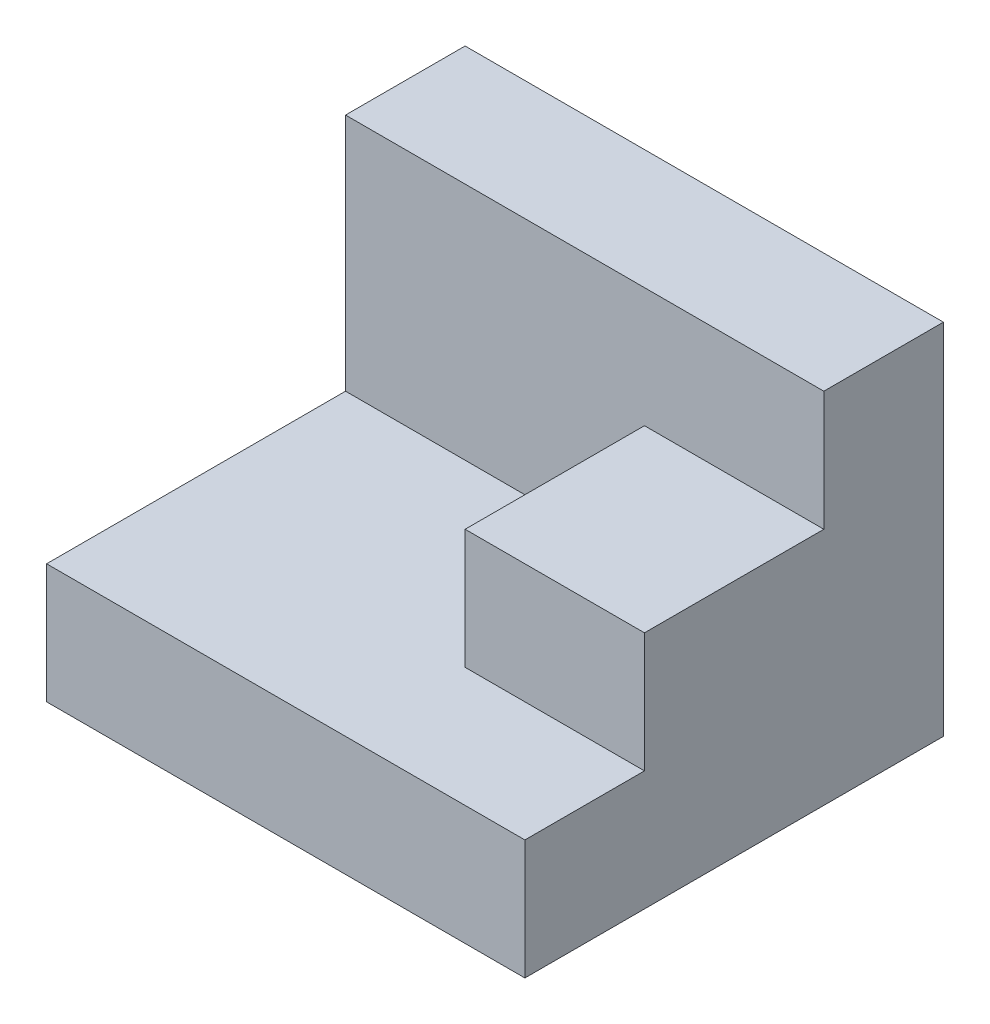
ISO-10303-21;
HEADER;
FILE_DESCRIPTION(('STEP AP214'),'2;1');
FILE_NAME('part.step','',(''),(''),'','','');
FILE_SCHEMA(('AUTOMOTIVE_DESIGN { 1 0 10303 214 1 1 1 1 }'));
ENDSEC;
DATA;
#1=APPLICATION_CONTEXT('core data for automotive mechanical design processes');
#2=APPLICATION_PROTOCOL_DEFINITION('international standard','automotive_design',2000,#1);
#3=PRODUCT_CONTEXT('',#1,'mechanical');
#4=PRODUCT('Part','Part','',(#3));
#5=PRODUCT_RELATED_PRODUCT_CATEGORY('part','',(#4));
#6=PRODUCT_DEFINITION_FORMATION('','',#4);
#7=PRODUCT_DEFINITION_CONTEXT('part definition',#1,'design');
#8=PRODUCT_DEFINITION('design','',#6,#7);
#9=PRODUCT_DEFINITION_SHAPE('','',#8);
#10=(LENGTH_UNIT() NAMED_UNIT(*) SI_UNIT(.MILLI.,.METRE.));
#11=(NAMED_UNIT(*) PLANE_ANGLE_UNIT() SI_UNIT($,.RADIAN.));
#12=(NAMED_UNIT(*) SI_UNIT($,.STERADIAN.) SOLID_ANGLE_UNIT());
#13=UNCERTAINTY_MEASURE_WITH_UNIT(LENGTH_MEASURE(1.E-05),#10,'distance_accuracy_value','');
#14=(GEOMETRIC_REPRESENTATION_CONTEXT(3) GLOBAL_UNCERTAINTY_ASSIGNED_CONTEXT((#13)) GLOBAL_UNIT_ASSIGNED_CONTEXT((#10,
#11,#12)) REPRESENTATION_CONTEXT('',''));
#15=CARTESIAN_POINT('',(0.,0.,0.));
#16=DIRECTION('',(0.,0.,1.));
#17=DIRECTION('',(1.,0.,0.));
#18=AXIS2_PLACEMENT_3D('',#15,#16,#17);
#19=CARTESIAN_POINT('',(0.,9.99999999999999,25.));
#20=DIRECTION('',(0.,-1.,0.));
#21=DIRECTION('',(1.,0.,0.));
#22=AXIS2_PLACEMENT_3D('',#19,#20,#21);
#23=PLANE('',#22);
#24=DIRECTION('',(0.,0.,-1.));
#25=VECTOR('',#24,1.);
#26=CARTESIAN_POINT('',(40.,10.,25.));
#27=LINE('',#26,#25);
#28=CARTESIAN_POINT('',(40.,10.,25.));
#29=VERTEX_POINT('',#28);
#30=CARTESIAN_POINT('',(40.,10.,15.));
#31=VERTEX_POINT('',#30);
#32=EDGE_CURVE('E128',#29,#31,#27,.T.);
#33=ORIENTED_EDGE('',*,*,#32,.T.);
#34=DIRECTION('',(-1.,0.,0.));
#35=VECTOR('',#34,1.);
#36=CARTESIAN_POINT('',(0.,9.99999999999999,15.));
#37=LINE('',#36,#35);
#38=CARTESIAN_POINT('',(25.,10.,15.));
#39=VERTEX_POINT('',#38);
#40=EDGE_CURVE('E190',#31,#39,#37,.T.);
#41=ORIENTED_EDGE('',*,*,#40,.T.);
#42=DIRECTION('',(0.,0.,-1.));
#43=VECTOR('',#42,1.);
#44=CARTESIAN_POINT('',(25.,10.,15.));
#45=LINE('',#44,#43);
#46=CARTESIAN_POINT('',(25.,10.,0.));
#47=VERTEX_POINT('',#46);
#48=EDGE_CURVE('E204',#39,#47,#45,.T.);
#49=ORIENTED_EDGE('',*,*,#48,.T.);
#50=DIRECTION('',(-1.,0.,0.));
#51=VECTOR('',#50,1.);
#52=CARTESIAN_POINT('',(0.,9.99999999999999,0.));
#53=LINE('',#52,#51);
#54=CARTESIAN_POINT('',(0.,9.99999999999999,0.));
#55=VERTEX_POINT('',#54);
#56=EDGE_CURVE('E79',#47,#55,#53,.T.);
#57=ORIENTED_EDGE('',*,*,#56,.T.);
#58=DIRECTION('',(0.,0.,-1.));
#59=VECTOR('',#58,1.);
#60=CARTESIAN_POINT('',(0.,9.99999999999999,25.));
#61=LINE('',#60,#59);
#62=CARTESIAN_POINT('',(0.,9.99999999999999,25.));
#63=VERTEX_POINT('',#62);
#64=EDGE_CURVE('E11',#63,#55,#61,.T.);
#65=ORIENTED_EDGE('',*,*,#64,.F.);
#66=DIRECTION('',(-1.,0.,0.));
#67=VECTOR('',#66,1.);
#68=CARTESIAN_POINT('',(0.,9.99999999999999,25.));
#69=LINE('',#68,#67);
#70=EDGE_CURVE('E107',#29,#63,#69,.T.);
#71=ORIENTED_EDGE('',*,*,#70,.F.);
#72=EDGE_LOOP('',(#33,#41,#49,#57,#65,#71));
#73=FACE_BOUND('',#72,.T.);
#74=ADVANCED_FACE('F43',(#73),#23,.F.);
#75=CARTESIAN_POINT('',(0.,0.,25.));
#76=DIRECTION('',(1.,0.,0.));
#77=DIRECTION('',(0.,1.,0.));
#78=AXIS2_PLACEMENT_3D('',#75,#76,#77);
#79=PLANE('',#78);
#80=ORIENTED_EDGE('',*,*,#64,.T.);
#81=DIRECTION('',(0.,1.,0.));
#82=VECTOR('',#81,1.);
#83=CARTESIAN_POINT('',(0.,0.,0.));
#84=LINE('',#83,#82);
#85=CARTESIAN_POINT('',(0.,30.,0.));
#86=VERTEX_POINT('',#85);
#87=EDGE_CURVE('E158',#55,#86,#84,.T.);
#88=ORIENTED_EDGE('',*,*,#87,.T.);
#89=DIRECTION('',(0.,0.,1.));
#90=VECTOR('',#89,1.);
#91=CARTESIAN_POINT('',(0.,30.,-10.));
#92=LINE('',#91,#90);
#93=CARTESIAN_POINT('',(0.,30.,-10.));
#94=VERTEX_POINT('',#93);
#95=EDGE_CURVE('E176',#94,#86,#92,.T.);
#96=ORIENTED_EDGE('',*,*,#95,.F.);
#97=DIRECTION('',(0.,1.,0.));
#98=VECTOR('',#97,1.);
#99=CARTESIAN_POINT('',(0.,0.,-10.));
#100=LINE('',#99,#98);
#101=CARTESIAN_POINT('',(0.,0.,-10.));
#102=VERTEX_POINT('',#101);
#103=EDGE_CURVE('E117',#102,#94,#100,.T.);
#104=ORIENTED_EDGE('',*,*,#103,.F.);
#105=DIRECTION('',(0.,0.,-1.));
#106=VECTOR('',#105,1.);
#107=CARTESIAN_POINT('',(0.,0.,25.));
#108=LINE('',#107,#106);
#109=CARTESIAN_POINT('',(0.,0.,25.));
#110=VERTEX_POINT('',#109);
#111=EDGE_CURVE('E51',#110,#102,#108,.T.);
#112=ORIENTED_EDGE('',*,*,#111,.F.);
#113=DIRECTION('',(0.,-1.,0.));
#114=VECTOR('',#113,1.);
#115=CARTESIAN_POINT('',(0.,0.,25.));
#116=LINE('',#115,#114);
#117=EDGE_CURVE('E100',#63,#110,#116,.T.);
#118=ORIENTED_EDGE('',*,*,#117,.F.);
#119=EDGE_LOOP('',(#80,#88,#96,#104,#112,#118));
#120=FACE_BOUND('',#119,.T.);
#121=ADVANCED_FACE('F113',(#120),#79,.F.);
#122=CARTESIAN_POINT('',(0.,0.,25.));
#123=DIRECTION('',(0.,1.,0.));
#124=DIRECTION('',(0.,0.,1.));
#125=AXIS2_PLACEMENT_3D('',#122,#123,#124);
#126=PLANE('',#125);
#127=ORIENTED_EDGE('',*,*,#111,.T.);
#128=DIRECTION('',(1.,0.,0.));
#129=VECTOR('',#128,1.);
#130=CARTESIAN_POINT('',(0.,0.,-10.));
#131=LINE('',#130,#129);
#132=CARTESIAN_POINT('',(40.,0.,-10.));
#133=VERTEX_POINT('',#132);
#134=EDGE_CURVE('E151',#102,#133,#131,.T.);
#135=ORIENTED_EDGE('',*,*,#134,.T.);
#136=DIRECTION('',(0.,0.,-1.));
#137=VECTOR('',#136,1.);
#138=CARTESIAN_POINT('',(40.,0.,25.));
#139=LINE('',#138,#137);
#140=CARTESIAN_POINT('',(40.,0.,25.));
#141=VERTEX_POINT('',#140);
#142=EDGE_CURVE('E122',#141,#133,#139,.T.);
#143=ORIENTED_EDGE('',*,*,#142,.F.);
#144=DIRECTION('',(1.,0.,0.));
#145=VECTOR('',#144,1.);
#146=CARTESIAN_POINT('',(0.,0.,25.));
#147=LINE('',#146,#145);
#148=EDGE_CURVE('E104',#110,#141,#147,.T.);
#149=ORIENTED_EDGE('',*,*,#148,.F.);
#150=EDGE_LOOP('',(#127,#135,#143,#149));
#151=FACE_BOUND('',#150,.T.);
#152=ADVANCED_FACE('F123',(#151),#126,.F.);
#153=CARTESIAN_POINT('',(40.,0.,25.));
#154=DIRECTION('',(-1.,0.,0.));
#155=DIRECTION('',(0.,0.,1.));
#156=AXIS2_PLACEMENT_3D('',#153,#154,#155);
#157=PLANE('',#156);
#158=ORIENTED_EDGE('',*,*,#142,.T.);
#159=DIRECTION('',(0.,-1.,0.));
#160=VECTOR('',#159,1.);
#161=CARTESIAN_POINT('',(40.,0.,-10.));
#162=LINE('',#161,#160);
#163=CARTESIAN_POINT('',(40.,30.,-10.));
#164=VERTEX_POINT('',#163);
#165=EDGE_CURVE('E145',#164,#133,#162,.T.);
#166=ORIENTED_EDGE('',*,*,#165,.F.);
#167=DIRECTION('',(0.,0.,1.));
#168=VECTOR('',#167,1.);
#169=CARTESIAN_POINT('',(40.,30.,-10.));
#170=LINE('',#169,#168);
#171=CARTESIAN_POINT('',(40.,30.,0.));
#172=VERTEX_POINT('',#171);
#173=EDGE_CURVE('E169',#164,#172,#170,.T.);
#174=ORIENTED_EDGE('',*,*,#173,.T.);
#175=DIRECTION('',(0.,-1.,0.));
#176=VECTOR('',#175,1.);
#177=CARTESIAN_POINT('',(40.,0.,0.));
#178=LINE('',#177,#176);
#179=CARTESIAN_POINT('',(40.,20.,0.));
#180=VERTEX_POINT('',#179);
#181=EDGE_CURVE('E170',#172,#180,#178,.T.);
#182=ORIENTED_EDGE('',*,*,#181,.T.);
#183=DIRECTION('',(0.,0.,-1.));
#184=VECTOR('',#183,1.);
#185=CARTESIAN_POINT('',(40.,20.,15.));
#186=LINE('',#185,#184);
#187=CARTESIAN_POINT('',(40.,20.,15.));
#188=VERTEX_POINT('',#187);
#189=EDGE_CURVE('E89',#188,#180,#186,.T.);
#190=ORIENTED_EDGE('',*,*,#189,.F.);
#191=DIRECTION('',(0.,-1.,0.));
#192=VECTOR('',#191,1.);
#193=CARTESIAN_POINT('',(40.,0.,15.));
#194=LINE('',#193,#192);
#195=EDGE_CURVE('E194',#188,#31,#194,.T.);
#196=ORIENTED_EDGE('',*,*,#195,.T.);
#197=ORIENTED_EDGE('',*,*,#32,.F.);
#198=DIRECTION('',(0.,1.,0.));
#199=VECTOR('',#198,1.);
#200=CARTESIAN_POINT('',(40.,0.,25.));
#201=LINE('',#200,#199);
#202=EDGE_CURVE('E67',#141,#29,#201,.T.);
#203=ORIENTED_EDGE('',*,*,#202,.F.);
#204=EDGE_LOOP('',(#158,#166,#174,#182,#190,#196,#197,#203));
#205=FACE_BOUND('',#204,.T.);
#206=ADVANCED_FACE('F142',(#205),#157,.F.);
#207=CARTESIAN_POINT('',(0.,0.,25.));
#208=DIRECTION('',(0.,0.,1.));
#209=DIRECTION('',(1.,0.,0.));
#210=AXIS2_PLACEMENT_3D('',#207,#208,#209);
#211=PLANE('',#210);
#212=ORIENTED_EDGE('',*,*,#70,.T.);
#213=ORIENTED_EDGE('',*,*,#117,.T.);
#214=ORIENTED_EDGE('',*,*,#148,.T.);
#215=ORIENTED_EDGE('',*,*,#202,.T.);
#216=EDGE_LOOP('',(#212,#213,#214,#215));
#217=FACE_BOUND('',#216,.T.);
#218=ADVANCED_FACE('F102',(#217),#211,.T.);
#219=CARTESIAN_POINT('',(0.,20.,15.));
#220=DIRECTION('',(0.,1.,0.));
#221=DIRECTION('',(0.,0.,1.));
#222=AXIS2_PLACEMENT_3D('',#219,#220,#221);
#223=PLANE('',#222);
#224=DIRECTION('',(1.,0.,0.));
#225=VECTOR('',#224,1.);
#226=CARTESIAN_POINT('',(0.,20.,0.));
#227=LINE('',#226,#225);
#228=CARTESIAN_POINT('',(25.,20.,0.));
#229=VERTEX_POINT('',#228);
#230=EDGE_CURVE('E180',#229,#180,#227,.T.);
#231=ORIENTED_EDGE('',*,*,#230,.F.);
#232=DIRECTION('',(0.,0.,-1.));
#233=VECTOR('',#232,1.);
#234=CARTESIAN_POINT('',(25.,20.,15.));
#235=LINE('',#234,#233);
#236=CARTESIAN_POINT('',(25.,20.,15.));
#237=VERTEX_POINT('',#236);
#238=EDGE_CURVE('E134',#237,#229,#235,.T.);
#239=ORIENTED_EDGE('',*,*,#238,.F.);
#240=DIRECTION('',(1.,0.,0.));
#241=VECTOR('',#240,1.);
#242=CARTESIAN_POINT('',(0.,20.,15.));
#243=LINE('',#242,#241);
#244=EDGE_CURVE('E183',#237,#188,#243,.T.);
#245=ORIENTED_EDGE('',*,*,#244,.T.);
#246=ORIENTED_EDGE('',*,*,#189,.T.);
#247=EDGE_LOOP('',(#231,#239,#245,#246));
#248=FACE_BOUND('',#247,.T.);
#249=ADVANCED_FACE('F215',(#248),#223,.T.);
#250=CARTESIAN_POINT('',(25.,0.,15.));
#251=DIRECTION('',(-1.,0.,0.));
#252=DIRECTION('',(0.,0.,1.));
#253=AXIS2_PLACEMENT_3D('',#250,#251,#252);
#254=PLANE('',#253);
#255=DIRECTION('',(0.,1.,0.));
#256=VECTOR('',#255,1.);
#257=CARTESIAN_POINT('',(25.,0.,0.));
#258=LINE('',#257,#256);
#259=EDGE_CURVE('E58',#47,#229,#258,.T.);
#260=ORIENTED_EDGE('',*,*,#259,.F.);
#261=ORIENTED_EDGE('',*,*,#48,.F.);
#262=DIRECTION('',(0.,1.,0.));
#263=VECTOR('',#262,1.);
#264=CARTESIAN_POINT('',(25.,0.,15.));
#265=LINE('',#264,#263);
#266=EDGE_CURVE('E186',#39,#237,#265,.T.);
#267=ORIENTED_EDGE('',*,*,#266,.T.);
#268=ORIENTED_EDGE('',*,*,#238,.T.);
#269=EDGE_LOOP('',(#260,#261,#267,#268));
#270=FACE_BOUND('',#269,.T.);
#271=ADVANCED_FACE('F211',(#270),#254,.T.);
#272=CARTESIAN_POINT('',(0.,0.,15.));
#273=DIRECTION('',(0.,0.,1.));
#274=DIRECTION('',(1.,0.,0.));
#275=AXIS2_PLACEMENT_3D('',#272,#273,#274);
#276=PLANE('',#275);
#277=ORIENTED_EDGE('',*,*,#244,.F.);
#278=ORIENTED_EDGE('',*,*,#266,.F.);
#279=ORIENTED_EDGE('',*,*,#40,.F.);
#280=ORIENTED_EDGE('',*,*,#195,.F.);
#281=EDGE_LOOP('',(#277,#278,#279,#280));
#282=FACE_BOUND('',#281,.T.);
#283=ADVANCED_FACE('F233',(#282),#276,.T.);
#284=CARTESIAN_POINT('',(0.,0.,0.));
#285=DIRECTION('',(0.,0.,1.));
#286=DIRECTION('',(1.,0.,0.));
#287=AXIS2_PLACEMENT_3D('',#284,#285,#286);
#288=PLANE('',#287);
#289=ORIENTED_EDGE('',*,*,#56,.F.);
#290=ORIENTED_EDGE('',*,*,#259,.T.);
#291=ORIENTED_EDGE('',*,*,#230,.T.);
#292=ORIENTED_EDGE('',*,*,#181,.F.);
#293=DIRECTION('',(1.,0.,0.));
#294=VECTOR('',#293,1.);
#295=CARTESIAN_POINT('',(0.,30.,0.));
#296=LINE('',#295,#294);
#297=EDGE_CURVE('E162',#86,#172,#296,.T.);
#298=ORIENTED_EDGE('',*,*,#297,.F.);
#299=ORIENTED_EDGE('',*,*,#87,.F.);
#300=EDGE_LOOP('',(#289,#290,#291,#292,#298,#299));
#301=FACE_BOUND('',#300,.T.);
#302=ADVANCED_FACE('F218',(#301),#288,.T.);
#303=CARTESIAN_POINT('',(0.,30.,-10.));
#304=DIRECTION('',(0.,-1.,0.));
#305=DIRECTION('',(0.,0.,-1.));
#306=AXIS2_PLACEMENT_3D('',#303,#304,#305);
#307=PLANE('',#306);
#308=ORIENTED_EDGE('',*,*,#297,.T.);
#309=ORIENTED_EDGE('',*,*,#173,.F.);
#310=DIRECTION('',(1.,0.,0.));
#311=VECTOR('',#310,1.);
#312=CARTESIAN_POINT('',(0.,30.,-10.));
#313=LINE('',#312,#311);
#314=EDGE_CURVE('E153',#94,#164,#313,.T.);
#315=ORIENTED_EDGE('',*,*,#314,.F.);
#316=ORIENTED_EDGE('',*,*,#95,.T.);
#317=EDGE_LOOP('',(#308,#309,#315,#316));
#318=FACE_BOUND('',#317,.T.);
#319=ADVANCED_FACE('F225',(#318),#307,.F.);
#320=CARTESIAN_POINT('',(0.,0.,-10.));
#321=DIRECTION('',(0.,0.,1.));
#322=DIRECTION('',(1.,0.,0.));
#323=AXIS2_PLACEMENT_3D('',#320,#321,#322);
#324=PLANE('',#323);
#325=ORIENTED_EDGE('',*,*,#134,.F.);
#326=ORIENTED_EDGE('',*,*,#103,.T.);
#327=ORIENTED_EDGE('',*,*,#314,.T.);
#328=ORIENTED_EDGE('',*,*,#165,.T.);
#329=EDGE_LOOP('',(#325,#326,#327,#328));
#330=FACE_BOUND('',#329,.T.);
#331=ADVANCED_FACE('F150',(#330),#324,.F.);
#332=CLOSED_SHELL('',(#74,#121,#152,#206,#218,#249,#271,#283,#302,#319,#331));
#333=MANIFOLD_SOLID_BREP('B2',#332);
#334=ADVANCED_BREP_SHAPE_REPRESENTATION('',(#18,#333),#14);
#335=SHAPE_DEFINITION_REPRESENTATION(#9,#334);
ENDSEC;
END-ISO-10303-21;
